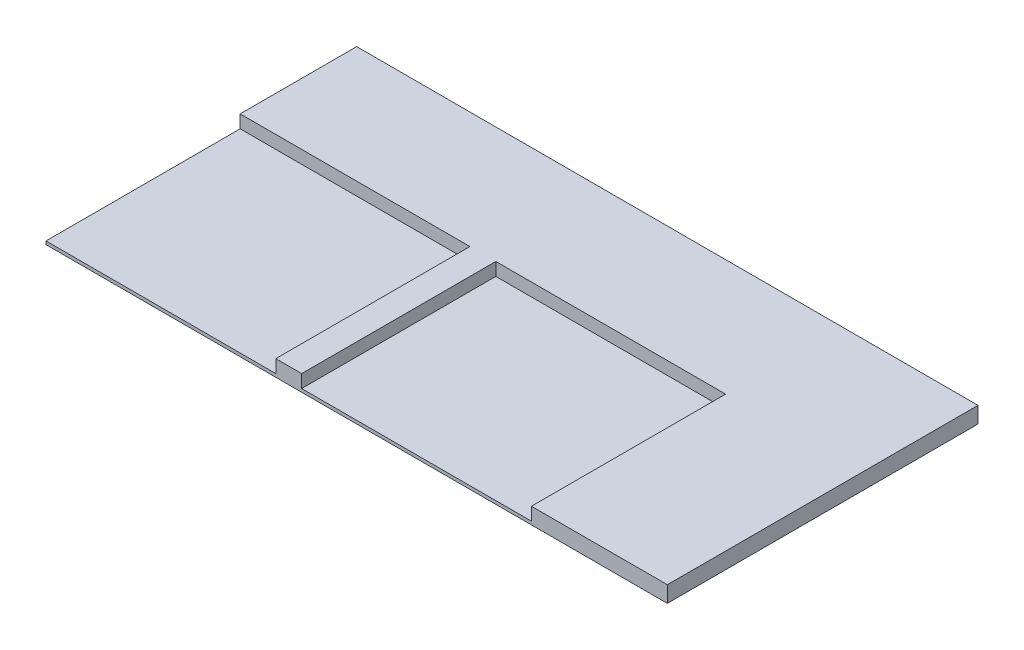
ISO-10303-21;
HEADER;
FILE_DESCRIPTION(('STEP AP214'),'2;1');
FILE_NAME('part.step','',(''),(''),'','','');
FILE_SCHEMA(('AUTOMOTIVE_DESIGN { 1 0 10303 214 1 1 1 1 }'));
ENDSEC;
DATA;
#1=APPLICATION_CONTEXT('core data for automotive mechanical design processes');
#2=APPLICATION_PROTOCOL_DEFINITION('international standard','automotive_design',2000,#1);
#3=PRODUCT_CONTEXT('',#1,'mechanical');
#4=PRODUCT('Part','Part','',(#3));
#5=PRODUCT_RELATED_PRODUCT_CATEGORY('part','',(#4));
#6=PRODUCT_DEFINITION_FORMATION('','',#4);
#7=PRODUCT_DEFINITION_CONTEXT('part definition',#1,'design');
#8=PRODUCT_DEFINITION('design','',#6,#7);
#9=PRODUCT_DEFINITION_SHAPE('','',#8);
#10=(LENGTH_UNIT() NAMED_UNIT(*) SI_UNIT(.MILLI.,.METRE.));
#11=(NAMED_UNIT(*) PLANE_ANGLE_UNIT() SI_UNIT($,.RADIAN.));
#12=(NAMED_UNIT(*) SI_UNIT($,.STERADIAN.) SOLID_ANGLE_UNIT());
#13=UNCERTAINTY_MEASURE_WITH_UNIT(LENGTH_MEASURE(1.E-05),#10,'distance_accuracy_value','');
#14=(GEOMETRIC_REPRESENTATION_CONTEXT(3) GLOBAL_UNCERTAINTY_ASSIGNED_CONTEXT((#13)) GLOBAL_UNIT_ASSIGNED_CONTEXT((#10,
#11,#12)) REPRESENTATION_CONTEXT('',''));
#15=CARTESIAN_POINT('',(0.,0.,0.));
#16=DIRECTION('',(0.,0.,1.));
#17=DIRECTION('',(1.,0.,0.));
#18=AXIS2_PLACEMENT_3D('',#15,#16,#17);
#19=CARTESIAN_POINT('',(0.,6.35,0.));
#20=DIRECTION('',(0.,-1.,0.));
#21=DIRECTION('',(0.,0.,-1.));
#22=AXIS2_PLACEMENT_3D('',#19,#20,#21);
#23=PLANE('',#22);
#24=DIRECTION('',(0.,0.,1.));
#25=VECTOR('',#24,1.);
#26=CARTESIAN_POINT('',(952.5,6.35,-381.));
#27=LINE('',#26,#25);
#28=CARTESIAN_POINT('',(952.5,6.35,-381.));
#29=VERTEX_POINT('',#28);
#30=CARTESIAN_POINT('',(952.5,6.35,0.));
#31=VERTEX_POINT('',#30);
#32=EDGE_CURVE('E67',#29,#31,#27,.T.);
#33=ORIENTED_EDGE('',*,*,#32,.F.);
#34=DIRECTION('',(1.,0.,0.));
#35=VECTOR('',#34,1.);
#36=CARTESIAN_POINT('',(0.,6.35,-381.));
#37=LINE('',#36,#35);
#38=CARTESIAN_POINT('',(501.65,6.35,-381.));
#39=VERTEX_POINT('',#38);
#40=EDGE_CURVE('E72',#39,#29,#37,.T.);
#41=ORIENTED_EDGE('',*,*,#40,.F.);
#42=DIRECTION('',(0.,0.,1.));
#43=VECTOR('',#42,1.);
#44=CARTESIAN_POINT('',(501.65,6.35,-381.));
#45=LINE('',#44,#43);
#46=CARTESIAN_POINT('',(501.65,6.35,0.));
#47=VERTEX_POINT('',#46);
#48=EDGE_CURVE('E190',#39,#47,#45,.T.);
#49=ORIENTED_EDGE('',*,*,#48,.T.);
#50=DIRECTION('',(1.,0.,0.));
#51=VECTOR('',#50,1.);
#52=CARTESIAN_POINT('',(0.,6.35,0.));
#53=LINE('',#52,#51);
#54=EDGE_CURVE('E227',#47,#31,#53,.T.);
#55=ORIENTED_EDGE('',*,*,#54,.T.);
#56=EDGE_LOOP('',(#33,#41,#49,#55));
#57=FACE_BOUND('',#56,.T.);
#58=ADVANCED_FACE('F51',(#57),#23,.F.);
#59=CARTESIAN_POINT('',(0.,6.35,-381.));
#60=VERTEX_POINT('',#59);
#61=CARTESIAN_POINT('',(450.85,6.35,-381.));
#62=VERTEX_POINT('',#61);
#63=EDGE_CURVE('E169',#60,#62,#37,.T.);
#64=ORIENTED_EDGE('',*,*,#63,.F.);
#65=DIRECTION('',(0.,0.,1.));
#66=VECTOR('',#65,1.);
#67=CARTESIAN_POINT('',(0.,6.35,0.));
#68=LINE('',#67,#66);
#69=CARTESIAN_POINT('',(0.,6.35,0.));
#70=VERTEX_POINT('',#69);
#71=EDGE_CURVE('E224',#60,#70,#68,.T.);
#72=ORIENTED_EDGE('',*,*,#71,.T.);
#73=CARTESIAN_POINT('',(450.85,6.35,0.));
#74=VERTEX_POINT('',#73);
#75=EDGE_CURVE('E229',#70,#74,#53,.T.);
#76=ORIENTED_EDGE('',*,*,#75,.T.);
#77=DIRECTION('',(0.,0.,1.));
#78=VECTOR('',#77,1.);
#79=CARTESIAN_POINT('',(450.85,6.35,-381.));
#80=LINE('',#79,#78);
#81=EDGE_CURVE('E182',#62,#74,#80,.T.);
#82=ORIENTED_EDGE('',*,*,#81,.F.);
#83=EDGE_LOOP('',(#64,#72,#76,#82));
#84=FACE_BOUND('',#83,.T.);
#85=ADVANCED_FACE('F276',(#84),#23,.F.);
#86=CARTESIAN_POINT('',(0.,6.35,0.));
#87=DIRECTION('',(1.,0.,0.));
#88=DIRECTION('',(0.,0.,-1.));
#89=AXIS2_PLACEMENT_3D('',#86,#87,#88);
#90=PLANE('',#89);
#91=DIRECTION('',(0.,0.,1.));
#92=VECTOR('',#91,1.);
#93=CARTESIAN_POINT('',(0.,0.,0.));
#94=LINE('',#93,#92);
#95=CARTESIAN_POINT('',(0.,0.,-609.6));
#96=VERTEX_POINT('',#95);
#97=CARTESIAN_POINT('',(0.,0.,0.));
#98=VERTEX_POINT('',#97);
#99=EDGE_CURVE('E205',#96,#98,#94,.T.);
#100=ORIENTED_EDGE('',*,*,#99,.T.);
#101=DIRECTION('',(0.,-1.,0.));
#102=VECTOR('',#101,1.);
#103=CARTESIAN_POINT('',(0.,6.35,0.));
#104=LINE('',#103,#102);
#105=EDGE_CURVE('E11',#70,#98,#104,.T.);
#106=ORIENTED_EDGE('',*,*,#105,.F.);
#107=ORIENTED_EDGE('',*,*,#71,.F.);
#108=DIRECTION('',(0.,-1.,0.));
#109=VECTOR('',#108,1.);
#110=CARTESIAN_POINT('',(0.,31.75,-381.));
#111=LINE('',#110,#109);
#112=CARTESIAN_POINT('',(0.,31.75,-381.));
#113=VERTEX_POINT('',#112);
#114=EDGE_CURVE('E165',#113,#60,#111,.T.);
#115=ORIENTED_EDGE('',*,*,#114,.F.);
#116=DIRECTION('',(0.,0.,1.));
#117=VECTOR('',#116,1.);
#118=CARTESIAN_POINT('',(0.,31.75,-609.6));
#119=LINE('',#118,#117);
#120=CARTESIAN_POINT('',(0.,31.75,-609.6));
#121=VERTEX_POINT('',#120);
#122=EDGE_CURVE('E162',#121,#113,#119,.T.);
#123=ORIENTED_EDGE('',*,*,#122,.F.);
#124=DIRECTION('',(0.,-1.,0.));
#125=VECTOR('',#124,1.);
#126=CARTESIAN_POINT('',(0.,6.35,-609.6));
#127=LINE('',#126,#125);
#128=EDGE_CURVE('E146',#121,#96,#127,.T.);
#129=ORIENTED_EDGE('',*,*,#128,.T.);
#130=EDGE_LOOP('',(#100,#106,#107,#115,#123,#129));
#131=FACE_BOUND('',#130,.T.);
#132=ADVANCED_FACE('F53',(#131),#90,.F.);
#133=CARTESIAN_POINT('',(0.,6.35,0.));
#134=DIRECTION('',(0.,0.,-1.));
#135=DIRECTION('',(-1.,0.,0.));
#136=AXIS2_PLACEMENT_3D('',#133,#134,#135);
#137=PLANE('',#136);
#138=DIRECTION('',(1.,0.,0.));
#139=VECTOR('',#138,1.);
#140=CARTESIAN_POINT('',(0.,0.,0.));
#141=LINE('',#140,#139);
#142=CARTESIAN_POINT('',(1219.2,0.,0.));
#143=VERTEX_POINT('',#142);
#144=EDGE_CURVE('E235',#98,#143,#141,.T.);
#145=ORIENTED_EDGE('',*,*,#144,.T.);
#146=DIRECTION('',(0.,-1.,0.));
#147=VECTOR('',#146,1.);
#148=CARTESIAN_POINT('',(1219.2,6.35,0.));
#149=LINE('',#148,#147);
#150=CARTESIAN_POINT('',(1219.2,31.75,0.));
#151=VERTEX_POINT('',#150);
#152=EDGE_CURVE('E60',#151,#143,#149,.T.);
#153=ORIENTED_EDGE('',*,*,#152,.F.);
#154=DIRECTION('',(1.,0.,0.));
#155=VECTOR('',#154,1.);
#156=CARTESIAN_POINT('',(952.5,31.75,0.));
#157=LINE('',#156,#155);
#158=CARTESIAN_POINT('',(952.5,31.75,0.));
#159=VERTEX_POINT('',#158);
#160=EDGE_CURVE('E154',#159,#151,#157,.T.);
#161=ORIENTED_EDGE('',*,*,#160,.F.);
#162=DIRECTION('',(0.,-1.,0.));
#163=VECTOR('',#162,1.);
#164=CARTESIAN_POINT('',(952.5,31.75,0.));
#165=LINE('',#164,#163);
#166=EDGE_CURVE('E193',#159,#31,#165,.T.);
#167=ORIENTED_EDGE('',*,*,#166,.T.);
#168=ORIENTED_EDGE('',*,*,#54,.F.);
#169=DIRECTION('',(0.,-1.,0.));
#170=VECTOR('',#169,1.);
#171=CARTESIAN_POINT('',(501.65,31.75,0.));
#172=LINE('',#171,#170);
#173=CARTESIAN_POINT('',(501.65,31.75,0.));
#174=VERTEX_POINT('',#173);
#175=EDGE_CURVE('E200',#174,#47,#172,.T.);
#176=ORIENTED_EDGE('',*,*,#175,.F.);
#177=DIRECTION('',(1.,0.,0.));
#178=VECTOR('',#177,1.);
#179=CARTESIAN_POINT('',(450.85,31.75,0.));
#180=LINE('',#179,#178);
#181=CARTESIAN_POINT('',(450.85,31.75,0.));
#182=VERTEX_POINT('',#181);
#183=EDGE_CURVE('E178',#182,#174,#180,.T.);
#184=ORIENTED_EDGE('',*,*,#183,.F.);
#185=DIRECTION('',(0.,-1.,0.));
#186=VECTOR('',#185,1.);
#187=CARTESIAN_POINT('',(450.85,31.75,0.));
#188=LINE('',#187,#186);
#189=EDGE_CURVE('E189',#182,#74,#188,.T.);
#190=ORIENTED_EDGE('',*,*,#189,.T.);
#191=ORIENTED_EDGE('',*,*,#75,.F.);
#192=ORIENTED_EDGE('',*,*,#105,.T.);
#193=EDGE_LOOP('',(#145,#153,#161,#167,#168,#176,#184,#190,#191,#192));
#194=FACE_BOUND('',#193,.T.);
#195=ADVANCED_FACE('F269',(#194),#137,.F.);
#196=CARTESIAN_POINT('',(1219.2,6.35,0.));
#197=DIRECTION('',(-1.,0.,0.));
#198=DIRECTION('',(0.,0.,1.));
#199=AXIS2_PLACEMENT_3D('',#196,#197,#198);
#200=PLANE('',#199);
#201=DIRECTION('',(0.,0.,-1.));
#202=VECTOR('',#201,1.);
#203=CARTESIAN_POINT('',(1219.2,0.,0.));
#204=LINE('',#203,#202);
#205=CARTESIAN_POINT('',(1219.2,0.,-609.6));
#206=VERTEX_POINT('',#205);
#207=EDGE_CURVE('E141',#143,#206,#204,.T.);
#208=ORIENTED_EDGE('',*,*,#207,.T.);
#209=DIRECTION('',(0.,-1.,0.));
#210=VECTOR('',#209,1.);
#211=CARTESIAN_POINT('',(1219.2,6.35,-609.6));
#212=LINE('',#211,#210);
#213=CARTESIAN_POINT('',(1219.2,31.75,-609.6));
#214=VERTEX_POINT('',#213);
#215=EDGE_CURVE('E134',#214,#206,#212,.T.);
#216=ORIENTED_EDGE('',*,*,#215,.F.);
#217=DIRECTION('',(0.,0.,1.));
#218=VECTOR('',#217,1.);
#219=CARTESIAN_POINT('',(1219.2,31.75,-609.6));
#220=LINE('',#219,#218);
#221=EDGE_CURVE('E138',#214,#151,#220,.T.);
#222=ORIENTED_EDGE('',*,*,#221,.T.);
#223=ORIENTED_EDGE('',*,*,#152,.T.);
#224=EDGE_LOOP('',(#208,#216,#222,#223));
#225=FACE_BOUND('',#224,.T.);
#226=ADVANCED_FACE('F136',(#225),#200,.F.);
#227=CARTESIAN_POINT('',(0.,6.35,-609.6));
#228=DIRECTION('',(0.,0.,1.));
#229=DIRECTION('',(1.,0.,0.));
#230=AXIS2_PLACEMENT_3D('',#227,#228,#229);
#231=PLANE('',#230);
#232=DIRECTION('',(-1.,0.,0.));
#233=VECTOR('',#232,1.);
#234=CARTESIAN_POINT('',(0.,0.,-609.6));
#235=LINE('',#234,#233);
#236=EDGE_CURVE('E228',#206,#96,#235,.T.);
#237=ORIENTED_EDGE('',*,*,#236,.T.);
#238=ORIENTED_EDGE('',*,*,#128,.F.);
#239=DIRECTION('',(1.,0.,0.));
#240=VECTOR('',#239,1.);
#241=CARTESIAN_POINT('',(0.,31.75,-609.6));
#242=LINE('',#241,#240);
#243=EDGE_CURVE('E152',#121,#214,#242,.T.);
#244=ORIENTED_EDGE('',*,*,#243,.T.);
#245=ORIENTED_EDGE('',*,*,#215,.T.);
#246=EDGE_LOOP('',(#237,#238,#244,#245));
#247=FACE_BOUND('',#246,.T.);
#248=ADVANCED_FACE('F158',(#247),#231,.F.);
#249=CARTESIAN_POINT('',(0.,0.,0.));
#250=DIRECTION('',(0.,-1.,0.));
#251=DIRECTION('',(0.,0.,-1.));
#252=AXIS2_PLACEMENT_3D('',#249,#250,#251);
#253=PLANE('',#252);
#254=ORIENTED_EDGE('',*,*,#99,.F.);
#255=ORIENTED_EDGE('',*,*,#236,.F.);
#256=ORIENTED_EDGE('',*,*,#207,.F.);
#257=ORIENTED_EDGE('',*,*,#144,.F.);
#258=EDGE_LOOP('',(#254,#255,#256,#257));
#259=FACE_BOUND('',#258,.T.);
#260=ADVANCED_FACE('F247',(#259),#253,.T.);
#261=CARTESIAN_POINT('',(0.,31.75,0.));
#262=DIRECTION('',(0.,-1.,0.));
#263=DIRECTION('',(0.,0.,-1.));
#264=AXIS2_PLACEMENT_3D('',#261,#262,#263);
#265=PLANE('',#264);
#266=DIRECTION('',(1.,0.,0.));
#267=VECTOR('',#266,1.);
#268=CARTESIAN_POINT('',(0.,31.75,-381.));
#269=LINE('',#268,#267);
#270=CARTESIAN_POINT('',(450.85,31.75,-381.));
#271=VERTEX_POINT('',#270);
#272=EDGE_CURVE('E156',#113,#271,#269,.T.);
#273=ORIENTED_EDGE('',*,*,#272,.T.);
#274=DIRECTION('',(0.,0.,1.));
#275=VECTOR('',#274,1.);
#276=CARTESIAN_POINT('',(450.85,31.75,-381.));
#277=LINE('',#276,#275);
#278=EDGE_CURVE('E186',#271,#182,#277,.T.);
#279=ORIENTED_EDGE('',*,*,#278,.T.);
#280=ORIENTED_EDGE('',*,*,#183,.T.);
#281=DIRECTION('',(0.,0.,1.));
#282=VECTOR('',#281,1.);
#283=CARTESIAN_POINT('',(501.65,31.75,-381.));
#284=LINE('',#283,#282);
#285=CARTESIAN_POINT('',(501.65,31.75,-381.));
#286=VERTEX_POINT('',#285);
#287=EDGE_CURVE('E181',#286,#174,#284,.T.);
#288=ORIENTED_EDGE('',*,*,#287,.F.);
#289=CARTESIAN_POINT('',(952.5,31.75,-381.));
#290=VERTEX_POINT('',#289);
#291=EDGE_CURVE('E173',#286,#290,#269,.T.);
#292=ORIENTED_EDGE('',*,*,#291,.T.);
#293=DIRECTION('',(0.,0.,1.));
#294=VECTOR('',#293,1.);
#295=CARTESIAN_POINT('',(952.5,31.75,-381.));
#296=LINE('',#295,#294);
#297=EDGE_CURVE('E214',#290,#159,#296,.T.);
#298=ORIENTED_EDGE('',*,*,#297,.T.);
#299=ORIENTED_EDGE('',*,*,#160,.T.);
#300=ORIENTED_EDGE('',*,*,#221,.F.);
#301=ORIENTED_EDGE('',*,*,#243,.F.);
#302=ORIENTED_EDGE('',*,*,#122,.T.);
#303=EDGE_LOOP('',(#273,#279,#280,#288,#292,#298,#299,#300,#301,#302));
#304=FACE_BOUND('',#303,.T.);
#305=ADVANCED_FACE('F151',(#304),#265,.F.);
#306=CARTESIAN_POINT('',(0.,31.75,-381.));
#307=DIRECTION('',(0.,0.,-1.));
#308=DIRECTION('',(-1.,0.,0.));
#309=AXIS2_PLACEMENT_3D('',#306,#307,#308);
#310=PLANE('',#309);
#311=ORIENTED_EDGE('',*,*,#291,.F.);
#312=DIRECTION('',(0.,-1.,0.));
#313=VECTOR('',#312,1.);
#314=CARTESIAN_POINT('',(501.65,31.75,-381.));
#315=LINE('',#314,#313);
#316=EDGE_CURVE('E206',#286,#39,#315,.T.);
#317=ORIENTED_EDGE('',*,*,#316,.T.);
#318=ORIENTED_EDGE('',*,*,#40,.T.);
#319=DIRECTION('',(0.,-1.,0.));
#320=VECTOR('',#319,1.);
#321=CARTESIAN_POINT('',(952.5,31.75,-381.));
#322=LINE('',#321,#320);
#323=EDGE_CURVE('E177',#290,#29,#322,.T.);
#324=ORIENTED_EDGE('',*,*,#323,.F.);
#325=EDGE_LOOP('',(#311,#317,#318,#324));
#326=FACE_BOUND('',#325,.T.);
#327=ADVANCED_FACE('F264',(#326),#310,.F.);
#328=DIRECTION('',(0.,-1.,0.));
#329=VECTOR('',#328,1.);
#330=CARTESIAN_POINT('',(450.85,31.75,-381.));
#331=LINE('',#330,#329);
#332=EDGE_CURVE('E201',#271,#62,#331,.T.);
#333=ORIENTED_EDGE('',*,*,#332,.F.);
#334=ORIENTED_EDGE('',*,*,#272,.F.);
#335=ORIENTED_EDGE('',*,*,#114,.T.);
#336=ORIENTED_EDGE('',*,*,#63,.T.);
#337=EDGE_LOOP('',(#333,#334,#335,#336));
#338=FACE_BOUND('',#337,.T.);
#339=ADVANCED_FACE('F308',(#338),#310,.F.);
#340=CARTESIAN_POINT('',(952.5,31.75,-381.));
#341=DIRECTION('',(1.,0.,0.));
#342=DIRECTION('',(0.,0.,-1.));
#343=AXIS2_PLACEMENT_3D('',#340,#341,#342);
#344=PLANE('',#343);
#345=ORIENTED_EDGE('',*,*,#32,.T.);
#346=ORIENTED_EDGE('',*,*,#166,.F.);
#347=ORIENTED_EDGE('',*,*,#297,.F.);
#348=ORIENTED_EDGE('',*,*,#323,.T.);
#349=EDGE_LOOP('',(#345,#346,#347,#348));
#350=FACE_BOUND('',#349,.T.);
#351=ADVANCED_FACE('F267',(#350),#344,.F.);
#352=CARTESIAN_POINT('',(501.65,31.75,-381.));
#353=DIRECTION('',(1.,0.,0.));
#354=DIRECTION('',(0.,0.,-1.));
#355=AXIS2_PLACEMENT_3D('',#352,#353,#354);
#356=PLANE('',#355);
#357=ORIENTED_EDGE('',*,*,#48,.F.);
#358=ORIENTED_EDGE('',*,*,#316,.F.);
#359=ORIENTED_EDGE('',*,*,#287,.T.);
#360=ORIENTED_EDGE('',*,*,#175,.T.);
#361=EDGE_LOOP('',(#357,#358,#359,#360));
#362=FACE_BOUND('',#361,.T.);
#363=ADVANCED_FACE('F316',(#362),#356,.T.);
#364=CARTESIAN_POINT('',(450.85,31.75,-381.));
#365=DIRECTION('',(1.,0.,0.));
#366=DIRECTION('',(0.,0.,-1.));
#367=AXIS2_PLACEMENT_3D('',#364,#365,#366);
#368=PLANE('',#367);
#369=ORIENTED_EDGE('',*,*,#81,.T.);
#370=ORIENTED_EDGE('',*,*,#189,.F.);
#371=ORIENTED_EDGE('',*,*,#278,.F.);
#372=ORIENTED_EDGE('',*,*,#332,.T.);
#373=EDGE_LOOP('',(#369,#370,#371,#372));
#374=FACE_BOUND('',#373,.T.);
#375=ADVANCED_FACE('F329',(#374),#368,.F.);
#376=CLOSED_SHELL('',(#58,#85,#132,#195,#226,#248,#260,#305,#327,#339,#351,#363,#375));
#377=MANIFOLD_SOLID_BREP('B2',#376);
#378=ADVANCED_BREP_SHAPE_REPRESENTATION('',(#18,#377),#14);
#379=SHAPE_DEFINITION_REPRESENTATION(#9,#378);
ENDSEC;
END-ISO-10303-21;
